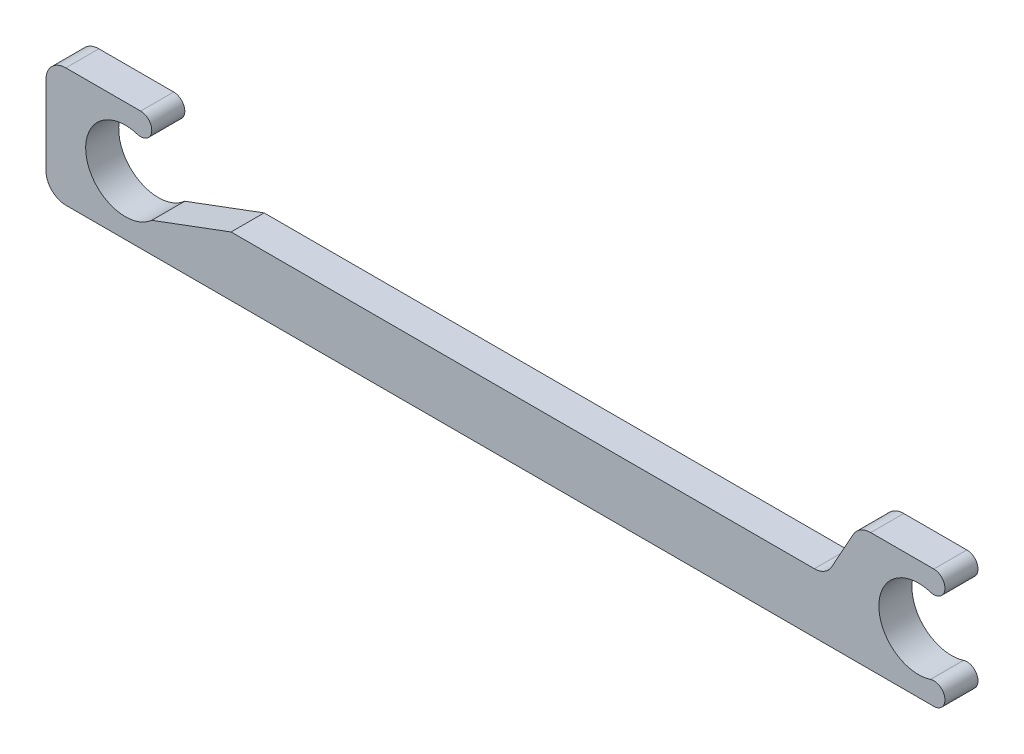
ISO-10303-21;
HEADER;
FILE_DESCRIPTION(('STEP AP214'),'2;1');
FILE_NAME('part.step','',(''),(''),'','','');
FILE_SCHEMA(('AUTOMOTIVE_DESIGN { 1 0 10303 214 1 1 1 1 }'));
ENDSEC;
DATA;
#1=APPLICATION_CONTEXT('core data for automotive mechanical design processes');
#2=APPLICATION_PROTOCOL_DEFINITION('international standard','automotive_design',2000,#1);
#3=PRODUCT_CONTEXT('',#1,'mechanical');
#4=PRODUCT('Part','Part','',(#3));
#5=PRODUCT_RELATED_PRODUCT_CATEGORY('part','',(#4));
#6=PRODUCT_DEFINITION_FORMATION('','',#4);
#7=PRODUCT_DEFINITION_CONTEXT('part definition',#1,'design');
#8=PRODUCT_DEFINITION('design','',#6,#7);
#9=PRODUCT_DEFINITION_SHAPE('','',#8);
#10=(LENGTH_UNIT() NAMED_UNIT(*) SI_UNIT(.MILLI.,.METRE.));
#11=(NAMED_UNIT(*) PLANE_ANGLE_UNIT() SI_UNIT($,.RADIAN.));
#12=(NAMED_UNIT(*) SI_UNIT($,.STERADIAN.) SOLID_ANGLE_UNIT());
#13=UNCERTAINTY_MEASURE_WITH_UNIT(LENGTH_MEASURE(1.E-05),#10,'distance_accuracy_value','');
#14=(GEOMETRIC_REPRESENTATION_CONTEXT(3) GLOBAL_UNCERTAINTY_ASSIGNED_CONTEXT((#13)) GLOBAL_UNIT_ASSIGNED_CONTEXT((#10,
#11,#12)) REPRESENTATION_CONTEXT('',''));
#15=CARTESIAN_POINT('',(0.,0.,0.));
#16=DIRECTION('',(0.,0.,1.));
#17=DIRECTION('',(1.,0.,0.));
#18=AXIS2_PLACEMENT_3D('',#15,#16,#17);
#19=CARTESIAN_POINT('',(61.8130168755118,-5.71952531326766,3.));
#20=CARTESIAN_POINT('',(61.8130168755118,-5.71952531326766,2.83333333333334));
#21=CARTESIAN_POINT('',(61.8130168755118,-5.71952531326766,2.66666666666665));
#22=CARTESIAN_POINT('',(61.8130168755118,-5.71952531326766,0.833333333333472));
#23=CARTESIAN_POINT('',(61.8130168755118,-5.71952531326766,-0.833333333332929));
#24=CARTESIAN_POINT('',(61.8130168755118,-5.71952531326766,-2.66666666666671));
#25=CARTESIAN_POINT('',(61.8130168755118,-5.71952531326766,-2.8333333333333));
#26=CARTESIAN_POINT('',(61.8130168755118,-5.71952531326766,-3.));
#27=CARTESIAN_POINT('',(62.9874962335552,-5.34723027487812,3.));
#28=CARTESIAN_POINT('',(62.9874962335552,-5.34723027487812,2.83333333333334));
#29=CARTESIAN_POINT('',(62.9874962335552,-5.34723027487812,2.66666666666665));
#30=CARTESIAN_POINT('',(62.9874962335552,-5.34723027487812,0.833333333333472));
#31=CARTESIAN_POINT('',(62.9874962335552,-5.34723027487812,-0.833333333332929));
#32=CARTESIAN_POINT('',(62.9874962335552,-5.34723027487812,-2.66666666666671));
#33=CARTESIAN_POINT('',(62.9874962335552,-5.34723027487812,-2.8333333333333));
#34=CARTESIAN_POINT('',(62.9874962335552,-5.34723027487812,-3.));
#35=CARTESIAN_POINT('',(65.0570686246106,-5.80753963794994,3.));
#36=CARTESIAN_POINT('',(65.0570686246106,-5.80753963794994,2.83333333333334));
#37=CARTESIAN_POINT('',(65.0570686246106,-5.80753963794994,2.66666666666665));
#38=CARTESIAN_POINT('',(65.0570686246106,-5.80753963794994,0.833333333333472));
#39=CARTESIAN_POINT('',(65.0570686246106,-5.80753963794994,-0.833333333332929));
#40=CARTESIAN_POINT('',(65.0570686246106,-5.80753963794994,-2.66666666666671));
#41=CARTESIAN_POINT('',(65.0570686246106,-5.80753963794994,-2.8333333333333));
#42=CARTESIAN_POINT('',(65.0570686246106,-5.80753963794994,-3.));
#43=CARTESIAN_POINT('',(65.3863188491197,-7.93584654598331,3.));
#44=CARTESIAN_POINT('',(65.3863188491197,-7.93584654598331,2.83333333333334));
#45=CARTESIAN_POINT('',(65.3863188491197,-7.93584654598331,2.66666666666665));
#46=CARTESIAN_POINT('',(65.3863188491197,-7.93584654598331,0.833333333333472));
#47=CARTESIAN_POINT('',(65.3863188491197,-7.93584654598331,-0.833333333332929));
#48=CARTESIAN_POINT('',(65.3863188491197,-7.93584654598331,-2.66666666666671));
#49=CARTESIAN_POINT('',(65.3863188491197,-7.93584654598331,-2.8333333333333));
#50=CARTESIAN_POINT('',(65.3863188491197,-7.93584654598331,-3.));
#51=CARTESIAN_POINT('',(63.552581676607,-9.,3.));
#52=CARTESIAN_POINT('',(63.552581676607,-9.,2.83333333333334));
#53=CARTESIAN_POINT('',(63.552581676607,-9.,2.66666666666665));
#54=CARTESIAN_POINT('',(63.552581676607,-9.,0.833333333333472));
#55=CARTESIAN_POINT('',(63.552581676607,-9.,-0.833333333332929));
#56=CARTESIAN_POINT('',(63.552581676607,-9.,-2.66666666666671));
#57=CARTESIAN_POINT('',(63.552581676607,-9.,-2.8333333333333));
#58=CARTESIAN_POINT('',(63.552581676607,-9.,-3.));
#59=CARTESIAN_POINT('',(62.3205080756888,-9.,3.));
#60=CARTESIAN_POINT('',(62.3205080756888,-9.,2.83333333333334));
#61=CARTESIAN_POINT('',(62.3205080756888,-9.,2.66666666666665));
#62=CARTESIAN_POINT('',(62.3205080756888,-9.,0.833333333333472));
#63=CARTESIAN_POINT('',(62.3205080756888,-9.,-0.833333333332929));
#64=CARTESIAN_POINT('',(62.3205080756888,-9.,-2.66666666666671));
#65=CARTESIAN_POINT('',(62.3205080756888,-9.,-2.8333333333333));
#66=CARTESIAN_POINT('',(62.3205080756888,-9.,-3.));
#67=(BOUNDED_SURFACE() B_SPLINE_SURFACE(5,3,((#19,#20,#21,#22,#23,#24,#25,#26),(#27,#28,#29,#30,
#31,#32,#33,#34),(#35,#36,#37,#38,#39,#40,#41,#42),(#43,#44,#45,#46,#47,#48,#49,#50),(#51,#52,
#53,#54,#55,#56,#57,#58),(#59,#60,#61,#62,#63,#64,#65,#66)),.UNSPECIFIED.,.F.,.F.,
.F.) B_SPLINE_SURFACE_WITH_KNOTS((6,6),(4,2,2,4),(0.,1.),(-0.1,0.,1.,1.1),
.UNSPECIFIED.) GEOMETRIC_REPRESENTATION_ITEM() RATIONAL_B_SPLINE_SURFACE(((1.,1.,1.,1.,1.,1.,1.,
1.),(0.53884722009782,0.53884722009782,0.53884722009782,0.53884722009782,0.53884722009782,
0.53884722009782,0.53884722009782,0.53884722009782),(0.308270830146729,0.308270830146729,
0.308270830146729,0.308270830146729,0.308270830146729,0.308270830146729,0.308270830146729,
0.308270830146729),(0.308270830146729,0.308270830146729,0.308270830146729,0.308270830146729,
0.308270830146729,0.308270830146729,0.308270830146729,0.308270830146729),(0.53884722009782,
0.53884722009782,0.53884722009782,0.53884722009782,0.53884722009782,0.53884722009782,
0.53884722009782,0.53884722009782),(1.,1.,1.,1.,1.,1.,1.,1.))) REPRESENTATION_ITEM('') SURFACE());
#68=CARTESIAN_POINT('',(61.8130168755118,-5.71952531326766,-3.));
#69=CARTESIAN_POINT('',(61.8130168755118,-5.71952531326766,-2.8333333333333));
#70=CARTESIAN_POINT('',(61.8130168755118,-5.71952531326766,-2.66666666666671));
#71=CARTESIAN_POINT('',(61.8130168755118,-5.71952531326766,-0.833333333332929));
#72=CARTESIAN_POINT('',(61.8130168755118,-5.71952531326766,0.833333333333472));
#73=CARTESIAN_POINT('',(61.8130168755118,-5.71952531326766,2.66666666666665));
#74=CARTESIAN_POINT('',(61.8130168755118,-5.71952531326766,2.83333333333334));
#75=CARTESIAN_POINT('',(61.8130168755118,-5.71952531326766,3.));
#76=(BOUNDED_CURVE() B_SPLINE_CURVE(3,(#68,#69,#70,#71,#72,#73,#74,#75),.UNSPECIFIED.,.F.,
.F.) B_SPLINE_CURVE_WITH_KNOTS((4,2,2,4),(-0.1,0.,1.,1.1),
.UNSPECIFIED.) CURVE() GEOMETRIC_REPRESENTATION_ITEM() RATIONAL_B_SPLINE_CURVE((1.,1.,1.,1.,1.,
1.,1.,1.)) REPRESENTATION_ITEM(''));
#77=CARTESIAN_POINT('',(61.8130168755118,-5.71952531326767,2.5));
#78=VERTEX_POINT('',#77);
#79=CARTESIAN_POINT('',(61.8130168755118,-5.71952531326766,-2.5));
#80=VERTEX_POINT('',#79);
#81=EDGE_CURVE('E305',#78,#80,#76,.F.);
#82=CARTESIAN_POINT('',(61.8130168755118,-5.71952531326766,2.5));
#83=CARTESIAN_POINT('',(62.9874962335552,-5.34723027487812,2.5));
#84=CARTESIAN_POINT('',(65.0570686246106,-5.80753963794994,2.5));
#85=CARTESIAN_POINT('',(65.3863188491197,-7.93584654598331,2.5));
#86=CARTESIAN_POINT('',(63.552581676607,-9.,2.5));
#87=CARTESIAN_POINT('',(62.3205080756888,-9.,2.5));
#88=(BOUNDED_CURVE() B_SPLINE_CURVE(5,(#82,#83,#84,#85,#86,#87),.UNSPECIFIED.,.F.,
.F.) B_SPLINE_CURVE_WITH_KNOTS((6,6),(0.,1.),
.UNSPECIFIED.) CURVE() GEOMETRIC_REPRESENTATION_ITEM() RATIONAL_B_SPLINE_CURVE((1.,
0.53884722009782,0.308270830146729,0.308270830146729,0.53884722009782,1.)) REPRESENTATION_ITEM(''));
#89=CARTESIAN_POINT('',(62.3205080756888,-9.,2.5));
#90=VERTEX_POINT('',#89);
#91=EDGE_CURVE('E578',#90,#78,#88,.F.);
#92=CARTESIAN_POINT('',(62.3205080756888,-9.,3.));
#93=CARTESIAN_POINT('',(62.3205080756888,-9.,2.83333333333334));
#94=CARTESIAN_POINT('',(62.3205080756888,-9.,2.66666666666665));
#95=CARTESIAN_POINT('',(62.3205080756888,-9.,0.833333333333472));
#96=CARTESIAN_POINT('',(62.3205080756888,-9.,-0.833333333332929));
#97=CARTESIAN_POINT('',(62.3205080756888,-9.,-2.66666666666671));
#98=CARTESIAN_POINT('',(62.3205080756888,-9.,-2.8333333333333));
#99=CARTESIAN_POINT('',(62.3205080756888,-9.,-3.));
#100=(BOUNDED_CURVE() B_SPLINE_CURVE(3,(#92,#93,#94,#95,#96,#97,#98,#99),.UNSPECIFIED.,.F.,
.F.) B_SPLINE_CURVE_WITH_KNOTS((4,2,2,4),(-0.1,0.,1.,1.1),
.UNSPECIFIED.) CURVE() GEOMETRIC_REPRESENTATION_ITEM() RATIONAL_B_SPLINE_CURVE((1.,1.,1.,1.,1.,
1.,1.,1.)) REPRESENTATION_ITEM(''));
#101=CARTESIAN_POINT('',(62.3205080756888,-9.,-2.5));
#102=VERTEX_POINT('',#101);
#103=EDGE_CURVE('E580',#102,#90,#100,.F.);
#104=CARTESIAN_POINT('',(62.3205080756888,-9.,-2.5));
#105=CARTESIAN_POINT('',(63.552581676607,-9.,-2.5));
#106=CARTESIAN_POINT('',(65.3863188491197,-7.93584654598331,-2.5));
#107=CARTESIAN_POINT('',(65.0570686246106,-5.80753963794994,-2.5));
#108=CARTESIAN_POINT('',(62.9874962335552,-5.34723027487812,-2.5));
#109=CARTESIAN_POINT('',(61.8130168755118,-5.71952531326766,-2.5));
#110=(BOUNDED_CURVE() B_SPLINE_CURVE(5,(#104,#105,#106,#107,#108,#109),.UNSPECIFIED.,.F.,
.F.) B_SPLINE_CURVE_WITH_KNOTS((6,6),(0.,1.),
.UNSPECIFIED.) CURVE() GEOMETRIC_REPRESENTATION_ITEM() RATIONAL_B_SPLINE_CURVE((1.,
0.53884722009782,0.308270830146729,0.308270830146729,0.53884722009782,1.)) REPRESENTATION_ITEM(''));
#111=EDGE_CURVE('E353',#80,#102,#110,.F.);
#112=ORIENTED_EDGE('',*,*,#81,.F.);
#113=ORIENTED_EDGE('',*,*,#91,.F.);
#114=ORIENTED_EDGE('',*,*,#103,.F.);
#115=ORIENTED_EDGE('',*,*,#111,.F.);
#116=EDGE_LOOP('',(#112,#113,#114,#115));
#117=FACE_BOUND('',#116,.T.);
#118=ADVANCED_FACE('F43',(#117),#67,.T.);
#119=CARTESIAN_POINT('',(62.3205080756769,9.00000000000001,3.));
#120=CARTESIAN_POINT('',(62.3205080756769,9.00000000000001,2.83333333333334));
#121=CARTESIAN_POINT('',(62.3205080756358,9.00000000000001,2.66666666666665));
#122=CARTESIAN_POINT('',(62.3205080756358,9.00000000000001,0.833333333333472));
#123=CARTESIAN_POINT('',(62.3205080756358,9.00000000000001,-0.833333333332929));
#124=CARTESIAN_POINT('',(62.3205080756358,9.00000000000001,-2.66666666666671));
#125=CARTESIAN_POINT('',(62.3205080756769,9.00000000000001,-2.8333333333333));
#126=CARTESIAN_POINT('',(62.3205080756769,9.00000000000001,-3.));
#127=CARTESIAN_POINT('',(63.5525816765993,9.00000000000611,3.));
#128=CARTESIAN_POINT('',(63.5525816765993,9.00000000000611,2.83333333333334));
#129=CARTESIAN_POINT('',(63.5525816765727,9.00000000002735,2.66666666666665));
#130=CARTESIAN_POINT('',(63.5525816765727,9.00000000002735,0.833333333333472));
#131=CARTESIAN_POINT('',(63.5525816765727,9.00000000002735,-0.833333333332929));
#132=CARTESIAN_POINT('',(63.5525816765727,9.00000000002735,-2.66666666666671));
#133=CARTESIAN_POINT('',(63.5525816765993,9.00000000000611,-2.8333333333333));
#134=CARTESIAN_POINT('',(63.5525816765993,9.00000000000611,-3.));
#135=CARTESIAN_POINT('',(65.3863188491365,7.93584654598996,3.));
#136=CARTESIAN_POINT('',(65.3863188491365,7.93584654598996,2.83333333333337));
#137=CARTESIAN_POINT('',(65.3863188491951,7.93584654601308,2.66666666666662));
#138=CARTESIAN_POINT('',(65.3863188491951,7.93584654601308,0.833333333333834));
#139=CARTESIAN_POINT('',(65.3863188491951,7.93584654601308,-0.83333333333329));
#140=CARTESIAN_POINT('',(65.3863188491951,7.93584654601308,-2.66666666666667));
#141=CARTESIAN_POINT('',(65.3863188491365,7.93584654598996,-2.83333333333333));
#142=CARTESIAN_POINT('',(65.3863188491365,7.93584654598996,-3.));
#143=CARTESIAN_POINT('',(65.0570686246242,5.80753963793814,3.));
#144=CARTESIAN_POINT('',(65.0570686246242,5.80753963793814,2.83333333333337));
#145=CARTESIAN_POINT('',(65.0570686246712,5.80753963789706,2.66666666666662));
#146=CARTESIAN_POINT('',(65.0570686246712,5.80753963789706,0.833333333333834));
#147=CARTESIAN_POINT('',(65.0570686246712,5.80753963789706,-0.83333333333329));
#148=CARTESIAN_POINT('',(65.0570686246712,5.80753963789706,-2.66666666666667));
#149=CARTESIAN_POINT('',(65.0570686246242,5.80753963793814,-2.83333333333333));
#150=CARTESIAN_POINT('',(65.0570686246242,5.80753963793814,-3.));
#151=CARTESIAN_POINT('',(62.9874962335452,5.34723027487464,3.));
#152=CARTESIAN_POINT('',(62.9874962335452,5.34723027487464,2.83333333333334));
#153=CARTESIAN_POINT('',(62.9874962335105,5.34723027486255,2.66666666666665));
#154=CARTESIAN_POINT('',(62.9874962335105,5.34723027486255,0.833333333333472));
#155=CARTESIAN_POINT('',(62.9874962335105,5.34723027486255,-0.833333333332929));
#156=CARTESIAN_POINT('',(62.9874962335105,5.34723027486255,-2.66666666666671));
#157=CARTESIAN_POINT('',(62.9874962335452,5.34723027487464,-2.8333333333333));
#158=CARTESIAN_POINT('',(62.9874962335452,5.34723027487464,-3.));
#159=CARTESIAN_POINT('',(61.8130168754997,5.71952531327148,3.));
#160=CARTESIAN_POINT('',(61.8130168754997,5.71952531327148,2.83333333333334));
#161=CARTESIAN_POINT('',(61.8130168754578,5.71952531328476,2.66666666666665));
#162=CARTESIAN_POINT('',(61.8130168754578,5.71952531328476,0.833333333333472));
#163=CARTESIAN_POINT('',(61.8130168754578,5.71952531328476,-0.833333333332929));
#164=CARTESIAN_POINT('',(61.8130168754578,5.71952531328476,-2.66666666666671));
#165=CARTESIAN_POINT('',(61.8130168754997,5.71952531327148,-2.8333333333333));
#166=CARTESIAN_POINT('',(61.8130168754997,5.71952531327148,-3.));
#167=(BOUNDED_SURFACE() B_SPLINE_SURFACE(5,3,((#119,#120,#121,#122,#123,#124,#125,#126),(#127,
#128,#129,#130,#131,#132,#133,#134),(#135,#136,#137,#138,#139,#140,#141,#142),(#143,#144,#145,
#146,#147,#148,#149,#150),(#151,#152,#153,#154,#155,#156,#157,#158),(#159,#160,#161,#162,#163,
#164,#165,#166)),.UNSPECIFIED.,.F.,.F.,.F.) B_SPLINE_SURFACE_WITH_KNOTS((6,6),(4,2,2,4),(0.,1.),
(-0.1,0.,1.,1.1),.UNSPECIFIED.) GEOMETRIC_REPRESENTATION_ITEM() RATIONAL_B_SPLINE_SURFACE(((1.,
1.,1.,1.,1.,1.,1.,1.),(0.538847220095827,0.538847220095827,0.538847220088886,0.538847220088886,
0.538847220088886,0.538847220088886,0.538847220095827,0.538847220095827),(0.30827083014374,
0.30827083014374,0.30827083013333,0.30827083013333,0.30827083013333,0.30827083013333,
0.30827083014374,0.30827083014374),(0.30827083014374,0.30827083014374,0.30827083013333,
0.30827083013333,0.30827083013333,0.30827083013333,0.30827083014374,0.30827083014374),
(0.538847220095827,0.538847220095827,0.538847220088886,0.538847220088886,0.538847220088886,
0.538847220088886,0.538847220095827,0.538847220095827),(1.,1.,1.,1.,1.,1.,1.,1.))) REPRESENTATION_ITEM('') SURFACE());
#168=CARTESIAN_POINT('',(61.8130168754997,5.71952531327148,3.));
#169=CARTESIAN_POINT('',(61.8130168754997,5.71952531327148,2.83333333333334));
#170=CARTESIAN_POINT('',(61.8130168754578,5.71952531328476,2.66666666666665));
#171=CARTESIAN_POINT('',(61.8130168754578,5.71952531328476,0.833333333333472));
#172=CARTESIAN_POINT('',(61.8130168754578,5.71952531328476,-0.833333333332929));
#173=CARTESIAN_POINT('',(61.8130168754578,5.71952531328476,-2.66666666666671));
#174=CARTESIAN_POINT('',(61.8130168754997,5.71952531327148,-2.8333333333333));
#175=CARTESIAN_POINT('',(61.8130168754997,5.71952531327148,-3.));
#176=(BOUNDED_CURVE() B_SPLINE_CURVE(3,(#168,#169,#170,#171,#172,#173,#174,#175),.UNSPECIFIED.,
.F.,.F.) B_SPLINE_CURVE_WITH_KNOTS((4,2,2,4),(-0.1,0.,1.,1.1),
.UNSPECIFIED.) CURVE() GEOMETRIC_REPRESENTATION_ITEM() RATIONAL_B_SPLINE_CURVE((1.,1.,1.,1.,1.,
1.,1.,1.)) REPRESENTATION_ITEM(''));
#177=CARTESIAN_POINT('',(61.8130168754578,5.71952531328476,-2.5));
#178=VERTEX_POINT('',#177);
#179=CARTESIAN_POINT('',(61.8130168754578,5.71952531328477,2.5));
#180=VERTEX_POINT('',#179);
#181=EDGE_CURVE('E565',#178,#180,#176,.F.);
#182=CARTESIAN_POINT('',(61.8130168754578,5.71952531328476,-2.5));
#183=CARTESIAN_POINT('',(62.9874962335105,5.34723027486255,-2.5));
#184=CARTESIAN_POINT('',(65.0570686246712,5.80753963789706,-2.5));
#185=CARTESIAN_POINT('',(65.3863188491951,7.93584654601308,-2.5));
#186=CARTESIAN_POINT('',(63.5525816765727,9.00000000002735,-2.5));
#187=CARTESIAN_POINT('',(62.3205080756358,9.00000000000001,-2.5));
#188=(BOUNDED_CURVE() B_SPLINE_CURVE(5,(#182,#183,#184,#185,#186,#187),.UNSPECIFIED.,.F.,
.F.) B_SPLINE_CURVE_WITH_KNOTS((6,6),(0.,1.),
.UNSPECIFIED.) CURVE() GEOMETRIC_REPRESENTATION_ITEM() RATIONAL_B_SPLINE_CURVE((1.,
0.538847220088886,0.30827083013333,0.30827083013333,0.538847220088886,1.)) REPRESENTATION_ITEM(''));
#189=CARTESIAN_POINT('',(62.3205080756358,9.00000000000001,-2.5));
#190=VERTEX_POINT('',#189);
#191=EDGE_CURVE('E260',#190,#178,#188,.F.);
#192=CARTESIAN_POINT('',(62.3205080756769,9.00000000000001,-3.));
#193=CARTESIAN_POINT('',(62.3205080756769,9.00000000000001,-2.8333333333333));
#194=CARTESIAN_POINT('',(62.3205080756358,9.00000000000001,-2.66666666666671));
#195=CARTESIAN_POINT('',(62.3205080756358,9.00000000000001,-0.833333333332929));
#196=CARTESIAN_POINT('',(62.3205080756358,9.00000000000001,0.833333333333472));
#197=CARTESIAN_POINT('',(62.3205080756358,9.00000000000001,2.66666666666665));
#198=CARTESIAN_POINT('',(62.3205080756769,9.00000000000001,2.83333333333334));
#199=CARTESIAN_POINT('',(62.3205080756769,9.00000000000001,3.));
#200=(BOUNDED_CURVE() B_SPLINE_CURVE(3,(#192,#193,#194,#195,#196,#197,#198,#199),.UNSPECIFIED.,
.F.,.F.) B_SPLINE_CURVE_WITH_KNOTS((4,2,2,4),(-0.1,0.,1.,1.1),
.UNSPECIFIED.) CURVE() GEOMETRIC_REPRESENTATION_ITEM() RATIONAL_B_SPLINE_CURVE((1.,1.,1.,1.,1.,
1.,1.,1.)) REPRESENTATION_ITEM(''));
#201=CARTESIAN_POINT('',(62.3205080756357,9.00000000000001,2.5));
#202=VERTEX_POINT('',#201);
#203=EDGE_CURVE('E574',#202,#190,#200,.F.);
#204=CARTESIAN_POINT('',(62.3205080756358,9.00000000000001,2.5));
#205=CARTESIAN_POINT('',(63.5525816765727,9.00000000002735,2.5));
#206=CARTESIAN_POINT('',(65.3863188491951,7.93584654601308,2.5));
#207=CARTESIAN_POINT('',(65.0570686246712,5.80753963789706,2.5));
#208=CARTESIAN_POINT('',(62.9874962335105,5.34723027486255,2.5));
#209=CARTESIAN_POINT('',(61.8130168754578,5.71952531328476,2.5));
#210=(BOUNDED_CURVE() B_SPLINE_CURVE(5,(#204,#205,#206,#207,#208,#209),.UNSPECIFIED.,.F.,
.F.) B_SPLINE_CURVE_WITH_KNOTS((6,6),(0.,1.),
.UNSPECIFIED.) CURVE() GEOMETRIC_REPRESENTATION_ITEM() RATIONAL_B_SPLINE_CURVE((1.,
0.538847220088886,0.30827083013333,0.30827083013333,0.538847220088886,1.)) REPRESENTATION_ITEM(''));
#211=EDGE_CURVE('E570',#180,#202,#210,.F.);
#212=ORIENTED_EDGE('',*,*,#181,.F.);
#213=ORIENTED_EDGE('',*,*,#191,.F.);
#214=ORIENTED_EDGE('',*,*,#203,.F.);
#215=ORIENTED_EDGE('',*,*,#211,.F.);
#216=EDGE_LOOP('',(#212,#213,#214,#215));
#217=FACE_BOUND('',#216,.T.);
#218=ADVANCED_FACE('F327',(#217),#167,.T.);
#219=CARTESIAN_POINT('',(-57.679491924323,9.,3.));
#220=CARTESIAN_POINT('',(-57.679491924323,9.,2.83333333333291));
#221=CARTESIAN_POINT('',(-57.6794919243631,9.,2.66666666666723));
#222=CARTESIAN_POINT('',(-57.6794919243758,9.,0.83333333332769));
#223=CARTESIAN_POINT('',(-57.6794919243642,9.,-0.833333333332929));
#224=CARTESIAN_POINT('',(-57.6794919243642,9.,-2.66666666666671));
#225=CARTESIAN_POINT('',(-57.679491924323,9.,-2.8333333333333));
#226=CARTESIAN_POINT('',(-57.679491924323,9.,-3.));
#227=CARTESIAN_POINT('',(-56.4474183234007,9.00000000000609,3.));
#228=CARTESIAN_POINT('',(-56.4474183234007,9.00000000000609,2.83333333333323));
#229=CARTESIAN_POINT('',(-56.4474183234262,9.00000000002647,2.66666666666663));
#230=CARTESIAN_POINT('',(-56.4474183234389,9.00000000003601,0.833333333315429));
#231=CARTESIAN_POINT('',(-56.4474183234273,9.00000000002734,-0.833333333332929));
#232=CARTESIAN_POINT('',(-56.4474183234273,9.00000000002734,-2.66666666666671));
#233=CARTESIAN_POINT('',(-56.4474183234007,9.00000000000609,-2.8333333333333));
#234=CARTESIAN_POINT('',(-56.4474183234007,9.00000000000609,-3.));
#235=CARTESIAN_POINT('',(-54.6136811508635,7.93584654598995,3.));
#236=CARTESIAN_POINT('',(-54.6136811508635,7.93584654598995,2.83333333333367));
#237=CARTESIAN_POINT('',(-54.6136811508083,7.93584654601234,2.66666666666579));
#238=CARTESIAN_POINT('',(-54.6136811507702,7.93584654602029,0.833333333294791));
#239=CARTESIAN_POINT('',(-54.6136811508049,7.93584654601306,-0.833333333332928));
#240=CARTESIAN_POINT('',(-54.6136811508049,7.93584654601306,-2.66666666666671));
#241=CARTESIAN_POINT('',(-54.6136811508635,7.93584654598995,-2.8333333333333));
#242=CARTESIAN_POINT('',(-54.6136811508635,7.93584654598995,-3.));
#243=CARTESIAN_POINT('',(-54.9429313753759,5.80753963793814,3.));
#244=CARTESIAN_POINT('',(-54.9429313753759,5.80753963793814,2.83333333333359));
#245=CARTESIAN_POINT('',(-54.9429313753317,5.80753963789857,2.6666666666659));
#246=CARTESIAN_POINT('',(-54.9429313752999,5.80753963788187,0.833333333293707));
#247=CARTESIAN_POINT('',(-54.9429313753288,5.80753963789705,-0.833333333332928));
#248=CARTESIAN_POINT('',(-54.9429313753288,5.80753963789705,-2.66666666666671));
#249=CARTESIAN_POINT('',(-54.9429313753759,5.80753963793814,-2.8333333333333));
#250=CARTESIAN_POINT('',(-54.9429313753759,5.80753963793814,-3.));
#251=CARTESIAN_POINT('',(-57.0125037664548,5.34723027487464,3.));
#252=CARTESIAN_POINT('',(-57.0125037664548,5.34723027487464,2.83333333333307));
#253=CARTESIAN_POINT('',(-57.0125037664883,5.34723027486312,2.66666666666685));
#254=CARTESIAN_POINT('',(-57.0125037665011,5.34723027485676,0.833333333313261));
#255=CARTESIAN_POINT('',(-57.0125037664895,5.34723027486254,-0.833333333332929));
#256=CARTESIAN_POINT('',(-57.0125037664895,5.34723027486254,-2.66666666666671));
#257=CARTESIAN_POINT('',(-57.0125037664548,5.34723027487464,-2.8333333333333));
#258=CARTESIAN_POINT('',(-57.0125037664548,5.34723027487464,-3.));
#259=CARTESIAN_POINT('',(-58.1869831245003,5.71952531327148,3.));
#260=CARTESIAN_POINT('',(-58.1869831245003,5.71952531327148,2.83333333333277));
#261=CARTESIAN_POINT('',(-58.186983124541,5.71952531328439,2.66666666666741));
#262=CARTESIAN_POINT('',(-58.1869831245537,5.71952531328842,0.833333333325883));
#263=CARTESIAN_POINT('',(-58.1869831245422,5.71952531328476,-0.833333333332929));
#264=CARTESIAN_POINT('',(-58.1869831245422,5.71952531328476,-2.66666666666671));
#265=CARTESIAN_POINT('',(-58.1869831245003,5.71952531327148,-2.8333333333333));
#266=CARTESIAN_POINT('',(-58.1869831245003,5.71952531327148,-3.));
#267=(BOUNDED_SURFACE() B_SPLINE_SURFACE(5,3,((#219,#220,#221,#222,#223,#224,#225,#226),(#227,
#228,#229,#230,#231,#232,#233,#234),(#235,#236,#237,#238,#239,#240,#241,#242),(#243,#244,#245,
#246,#247,#248,#249,#250),(#251,#252,#253,#254,#255,#256,#257,#258),(#259,#260,#261,#262,#263,
#264,#265,#266)),.UNSPECIFIED.,.F.,.F.,.F.) B_SPLINE_SURFACE_WITH_KNOTS((6,6),(4,2,2,4),(0.,1.),
(-0.1,0.,1.,1.1),.UNSPECIFIED.) GEOMETRIC_REPRESENTATION_ITEM() RATIONAL_B_SPLINE_SURFACE(((1.,
1.,1.,1.,1.,1.,1.,1.),(0.538847220095827,0.538847220095827,0.538847220089423,0.53884722008352,
0.538847220088886,0.538847220088886,0.538847220095827,0.538847220095827),(0.30827083014374,
0.30827083014374,0.308270830134125,0.308270830125373,0.308270830133329,0.308270830133329,
0.30827083014374,0.30827083014374),(0.30827083014374,0.30827083014374,0.308270830134125,
0.308270830125373,0.308270830133329,0.308270830133329,0.30827083014374,0.30827083014374),
(0.538847220095827,0.538847220095827,0.538847220089423,0.53884722008352,0.538847220088886,
0.538847220088886,0.538847220095827,0.538847220095827),(1.,1.,1.,1.,1.,1.,1.,1.))) REPRESENTATION_ITEM('') SURFACE());
#268=CARTESIAN_POINT('',(-58.1869831245003,5.71952531327148,3.));
#269=CARTESIAN_POINT('',(-58.1869831245003,5.71952531327148,2.83333333333277));
#270=CARTESIAN_POINT('',(-58.186983124541,5.71952531328439,2.66666666666741));
#271=CARTESIAN_POINT('',(-58.1869831245537,5.71952531328842,0.833333333325883));
#272=CARTESIAN_POINT('',(-58.1869831245422,5.71952531328476,-0.833333333332929));
#273=CARTESIAN_POINT('',(-58.1869831245422,5.71952531328476,-2.66666666666671));
#274=CARTESIAN_POINT('',(-58.1869831245003,5.71952531327148,-2.8333333333333));
#275=CARTESIAN_POINT('',(-58.1869831245003,5.71952531327148,-3.));
#276=(BOUNDED_CURVE() B_SPLINE_CURVE(3,(#268,#269,#270,#271,#272,#273,#274,#275),.UNSPECIFIED.,
.F.,.F.) B_SPLINE_CURVE_WITH_KNOTS((4,2,2,4),(-0.1,0.,1.,1.1),
.UNSPECIFIED.) CURVE() GEOMETRIC_REPRESENTATION_ITEM() RATIONAL_B_SPLINE_CURVE((1.,1.,1.,1.,1.,
1.,1.,1.)) REPRESENTATION_ITEM(''));
#277=CARTESIAN_POINT('',(-58.1869831245422,5.71952531328476,-2.5));
#278=VERTEX_POINT('',#277);
#279=CARTESIAN_POINT('',(-58.1869831245422,5.71952531328477,2.5));
#280=VERTEX_POINT('',#279);
#281=EDGE_CURVE('E182',#278,#280,#276,.F.);
#282=CARTESIAN_POINT('',(-58.1869831245422,5.71952531328476,-2.5));
#283=CARTESIAN_POINT('',(-57.0125037664895,5.34723027486254,-2.5));
#284=CARTESIAN_POINT('',(-54.9429313753288,5.80753963789705,-2.5));
#285=CARTESIAN_POINT('',(-54.6136811508049,7.93584654601306,-2.5));
#286=CARTESIAN_POINT('',(-56.4474183234273,9.00000000002734,-2.5));
#287=CARTESIAN_POINT('',(-57.6794919243642,9.,-2.5));
#288=(BOUNDED_CURVE() B_SPLINE_CURVE(5,(#282,#283,#284,#285,#286,#287),.UNSPECIFIED.,.F.,
.F.) B_SPLINE_CURVE_WITH_KNOTS((6,6),(0.,1.),
.UNSPECIFIED.) CURVE() GEOMETRIC_REPRESENTATION_ITEM() RATIONAL_B_SPLINE_CURVE((1.,
0.538847220088886,0.308270830133329,0.308270830133329,0.538847220088886,1.)) REPRESENTATION_ITEM(''));
#289=CARTESIAN_POINT('',(-57.6794919243642,9.,-2.5));
#290=VERTEX_POINT('',#289);
#291=EDGE_CURVE('E508',#290,#278,#288,.F.);
#292=CARTESIAN_POINT('',(-57.679491924323,9.,-3.));
#293=CARTESIAN_POINT('',(-57.679491924323,9.,-2.8333333333333));
#294=CARTESIAN_POINT('',(-57.6794919243642,9.,-2.66666666666671));
#295=CARTESIAN_POINT('',(-57.6794919243642,9.,-0.833333333332929));
#296=CARTESIAN_POINT('',(-57.6794919243758,9.,0.83333333332769));
#297=CARTESIAN_POINT('',(-57.6794919243631,9.,2.66666666666723));
#298=CARTESIAN_POINT('',(-57.679491924323,9.,2.83333333333291));
#299=CARTESIAN_POINT('',(-57.679491924323,9.,3.));
#300=(BOUNDED_CURVE() B_SPLINE_CURVE(3,(#292,#293,#294,#295,#296,#297,#298,#299),.UNSPECIFIED.,
.F.,.F.) B_SPLINE_CURVE_WITH_KNOTS((4,2,2,4),(-0.1,0.,1.,1.1),
.UNSPECIFIED.) CURVE() GEOMETRIC_REPRESENTATION_ITEM() RATIONAL_B_SPLINE_CURVE((1.,1.,1.,1.,1.,
1.,1.,1.)) REPRESENTATION_ITEM(''));
#301=CARTESIAN_POINT('',(-57.6794919243642,9.,2.5));
#302=VERTEX_POINT('',#301);
#303=EDGE_CURVE('E500',#302,#290,#300,.F.);
#304=CARTESIAN_POINT('',(-57.6794919243642,9.,2.5));
#305=CARTESIAN_POINT('',(-56.4474183234273,9.00000000002734,2.5));
#306=CARTESIAN_POINT('',(-54.6136811508049,7.93584654601306,2.5));
#307=CARTESIAN_POINT('',(-54.9429313753288,5.80753963789705,2.5));
#308=CARTESIAN_POINT('',(-57.0125037664895,5.34723027486254,2.5));
#309=CARTESIAN_POINT('',(-58.1869831245422,5.71952531328476,2.5));
#310=(BOUNDED_CURVE() B_SPLINE_CURVE(5,(#304,#305,#306,#307,#308,#309),.UNSPECIFIED.,.F.,
.F.) B_SPLINE_CURVE_WITH_KNOTS((6,6),(0.,1.),
.UNSPECIFIED.) CURVE() GEOMETRIC_REPRESENTATION_ITEM() RATIONAL_B_SPLINE_CURVE((1.,
0.538847220088886,0.308270830133329,0.308270830133329,0.538847220088886,1.)) REPRESENTATION_ITEM(''));
#311=EDGE_CURVE('E495',#280,#302,#310,.F.);
#312=ORIENTED_EDGE('',*,*,#281,.F.);
#313=ORIENTED_EDGE('',*,*,#291,.F.);
#314=ORIENTED_EDGE('',*,*,#303,.F.);
#315=ORIENTED_EDGE('',*,*,#311,.F.);
#316=EDGE_LOOP('',(#312,#313,#314,#315));
#317=FACE_BOUND('',#316,.T.);
#318=ADVANCED_FACE('F513',(#317),#267,.T.);
#319=CARTESIAN_POINT('',(60.,0.,2.5));
#320=DIRECTION('',(0.,0.,-1.));
#321=DIRECTION('',(-1.,0.,0.));
#322=AXIS2_PLACEMENT_3D('',#319,#320,#321);
#323=CYLINDRICAL_SURFACE('',#322,6.);
#324=CARTESIAN_POINT('',(60.,0.,2.5));
#325=DIRECTION('',(0.,0.,1.));
#326=DIRECTION('',(1.,0.,0.));
#327=AXIS2_PLACEMENT_3D('',#324,#325,#326);
#328=CIRCLE('',#327,6.);
#329=EDGE_CURVE('E377',#180,#78,#328,.T.);
#330=ORIENTED_EDGE('',*,*,#329,.T.);
#331=ORIENTED_EDGE('',*,*,#81,.T.);
#332=CARTESIAN_POINT('',(60.,0.,-2.5));
#333=DIRECTION('',(0.,0.,1.));
#334=DIRECTION('',(1.,0.,0.));
#335=AXIS2_PLACEMENT_3D('',#332,#333,#334);
#336=CIRCLE('',#335,6.);
#337=EDGE_CURVE('E403',#178,#80,#336,.T.);
#338=ORIENTED_EDGE('',*,*,#337,.F.);
#339=ORIENTED_EDGE('',*,*,#181,.T.);
#340=EDGE_LOOP('',(#330,#331,#338,#339));
#341=FACE_BOUND('',#340,.T.);
#342=ADVANCED_FACE('F240',(#341),#323,.F.);
#343=CARTESIAN_POINT('',(0.,9.00000000000001,2.5));
#344=DIRECTION('',(0.,-1.,0.));
#345=DIRECTION('',(1.,0.,0.));
#346=AXIS2_PLACEMENT_3D('',#343,#344,#345);
#347=PLANE('',#346);
#348=DIRECTION('',(-1.,0.,0.));
#349=VECTOR('',#348,1.);
#350=CARTESIAN_POINT('',(0.,9.00000000000001,-2.5));
#351=LINE('',#350,#349);
#352=CARTESIAN_POINT('',(52.7652100469957,9.00000000000001,-2.5));
#353=VERTEX_POINT('',#352);
#354=EDGE_CURVE('E407',#190,#353,#351,.T.);
#355=ORIENTED_EDGE('',*,*,#354,.T.);
#356=DIRECTION('',(0.,0.,-1.));
#357=VECTOR('',#356,1.);
#358=CARTESIAN_POINT('',(52.7652100469957,9.00000000000001,2.5));
#359=LINE('',#358,#357);
#360=CARTESIAN_POINT('',(52.7652100469957,9.00000000000001,2.5));
#361=VERTEX_POINT('',#360);
#362=EDGE_CURVE('E393',#353,#361,#359,.F.);
#363=ORIENTED_EDGE('',*,*,#362,.T.);
#364=DIRECTION('',(-1.,0.,0.));
#365=VECTOR('',#364,1.);
#366=CARTESIAN_POINT('',(0.,9.00000000000001,2.5));
#367=LINE('',#366,#365);
#368=EDGE_CURVE('E414',#202,#361,#367,.T.);
#369=ORIENTED_EDGE('',*,*,#368,.F.);
#370=ORIENTED_EDGE('',*,*,#203,.T.);
#371=EDGE_LOOP('',(#355,#363,#369,#370));
#372=FACE_BOUND('',#371,.T.);
#373=ADVANCED_FACE('F235',(#372),#347,.F.);
#374=CARTESIAN_POINT('',(35.1509433962264,-19.5283018867924,2.5));
#375=DIRECTION('',(0.874157276121538,-0.485642931178632,0.));
#376=DIRECTION('',(0.485642931178632,0.874157276121538,0.));
#377=AXIS2_PLACEMENT_3D('',#374,#375,#376);
#378=PLANE('',#377);
#379=DIRECTION('',(-0.485642931178632,-0.874157276121538,0.));
#380=VECTOR('',#379,1.);
#381=CARTESIAN_POINT('',(35.1509433962264,-19.5283018867924,-2.5));
#382=LINE('',#381,#380);
#383=CARTESIAN_POINT('',(50.1427382186311,7.45692879353591,-2.5));
#384=VERTEX_POINT('',#383);
#385=CARTESIAN_POINT('',(46.857261781369,1.54307120646411,-2.5));
#386=VERTEX_POINT('',#385);
#387=EDGE_CURVE('E424',#384,#386,#382,.T.);
#388=ORIENTED_EDGE('',*,*,#387,.T.);
#389=DIRECTION('',(0.,0.,-1.));
#390=VECTOR('',#389,1.);
#391=CARTESIAN_POINT('',(46.8572617813689,1.5430712064641,2.5));
#392=LINE('',#391,#390);
#393=CARTESIAN_POINT('',(46.857261781369,1.54307120646411,2.5));
#394=VERTEX_POINT('',#393);
#395=EDGE_CURVE('E369',#386,#394,#392,.F.);
#396=ORIENTED_EDGE('',*,*,#395,.T.);
#397=DIRECTION('',(-0.485642931178632,-0.874157276121538,0.));
#398=VECTOR('',#397,1.);
#399=CARTESIAN_POINT('',(35.1509433962264,-19.5283018867924,2.5));
#400=LINE('',#399,#398);
#401=CARTESIAN_POINT('',(50.1427382186311,7.45692879353591,2.5));
#402=VERTEX_POINT('',#401);
#403=EDGE_CURVE('E171',#402,#394,#400,.T.);
#404=ORIENTED_EDGE('',*,*,#403,.F.);
#405=DIRECTION('',(0.,0.,-1.));
#406=VECTOR('',#405,1.);
#407=CARTESIAN_POINT('',(50.1427382186311,7.4569287935359,2.5));
#408=LINE('',#407,#406);
#409=EDGE_CURVE('E365',#402,#384,#408,.T.);
#410=ORIENTED_EDGE('',*,*,#409,.T.);
#411=EDGE_LOOP('',(#388,#396,#404,#410));
#412=FACE_BOUND('',#411,.T.);
#413=ADVANCED_FACE('F232',(#412),#378,.F.);
#414=CARTESIAN_POINT('',(0.,0.,2.5));
#415=DIRECTION('',(0.,-1.,0.));
#416=DIRECTION('',(1.,0.,0.));
#417=AXIS2_PLACEMENT_3D('',#414,#415,#416);
#418=PLANE('',#417);
#419=DIRECTION('',(-1.,0.,0.));
#420=VECTOR('',#419,1.);
#421=CARTESIAN_POINT('',(0.,0.,2.5));
#422=LINE('',#421,#420);
#423=CARTESIAN_POINT('',(44.2347899530043,0.,2.5));
#424=VERTEX_POINT('',#423);
#425=CARTESIAN_POINT('',(-44.,0.,2.5));
#426=VERTEX_POINT('',#425);
#427=EDGE_CURVE('E157',#424,#426,#422,.T.);
#428=ORIENTED_EDGE('',*,*,#427,.F.);
#429=DIRECTION('',(0.,0.,-1.));
#430=VECTOR('',#429,1.);
#431=CARTESIAN_POINT('',(44.2347899530043,0.,-2.5));
#432=LINE('',#431,#430);
#433=CARTESIAN_POINT('',(44.2347899530043,0.,-2.5));
#434=VERTEX_POINT('',#433);
#435=EDGE_CURVE('E357',#424,#434,#432,.T.);
#436=ORIENTED_EDGE('',*,*,#435,.T.);
#437=DIRECTION('',(-1.,0.,0.));
#438=VECTOR('',#437,1.);
#439=CARTESIAN_POINT('',(0.,0.,-2.5));
#440=LINE('',#439,#438);
#441=CARTESIAN_POINT('',(-44.,0.,-2.5));
#442=VERTEX_POINT('',#441);
#443=EDGE_CURVE('E177',#434,#442,#440,.T.);
#444=ORIENTED_EDGE('',*,*,#443,.T.);
#445=DIRECTION('',(0.,0.,-1.));
#446=VECTOR('',#445,1.);
#447=CARTESIAN_POINT('',(-44.,0.,2.5));
#448=LINE('',#447,#446);
#449=EDGE_CURVE('E174',#426,#442,#448,.T.);
#450=ORIENTED_EDGE('',*,*,#449,.F.);
#451=EDGE_LOOP('',(#428,#436,#444,#450));
#452=FACE_BOUND('',#451,.T.);
#453=ADVANCED_FACE('F175',(#452),#418,.F.);
#454=CARTESIAN_POINT('',(-5.36585365853658,14.3980962453645,2.5));
#455=DIRECTION('',(0.349215147884789,-0.937042571331636,0.));
#456=DIRECTION('',(0.937042571331636,0.349215147884789,0.));
#457=AXIS2_PLACEMENT_3D('',#454,#455,#456);
#458=PLANE('',#457);
#459=DIRECTION('',(-0.937042571331637,-0.349215147884789,0.));
#460=VECTOR('',#459,1.);
#461=CARTESIAN_POINT('',(-5.36585365853658,14.3980962453645,-2.5));
#462=LINE('',#461,#460);
#463=CARTESIAN_POINT('',(-56.,-4.47213595499958,-2.5));
#464=VERTEX_POINT('',#463);
#465=EDGE_CURVE('E438',#442,#464,#462,.T.);
#466=ORIENTED_EDGE('',*,*,#465,.T.);
#467=DIRECTION('',(0.,0.,-1.));
#468=VECTOR('',#467,1.);
#469=CARTESIAN_POINT('',(-56.,-4.47213595499958,2.5));
#470=LINE('',#469,#468);
#471=CARTESIAN_POINT('',(-56.,-4.47213595499958,2.5));
#472=VERTEX_POINT('',#471);
#473=EDGE_CURVE('E183',#472,#464,#470,.T.);
#474=ORIENTED_EDGE('',*,*,#473,.F.);
#475=DIRECTION('',(-0.937042571331637,-0.349215147884789,0.));
#476=VECTOR('',#475,1.);
#477=CARTESIAN_POINT('',(-5.36585365853658,14.3980962453645,2.5));
#478=LINE('',#477,#476);
#479=EDGE_CURVE('E163',#426,#472,#478,.T.);
#480=ORIENTED_EDGE('',*,*,#479,.F.);
#481=ORIENTED_EDGE('',*,*,#449,.T.);
#482=EDGE_LOOP('',(#466,#474,#480,#481));
#483=FACE_BOUND('',#482,.T.);
#484=ADVANCED_FACE('F185',(#483),#458,.F.);
#485=CARTESIAN_POINT('',(-60.,0.,2.5));
#486=DIRECTION('',(0.,0.,-1.));
#487=DIRECTION('',(-1.,0.,0.));
#488=AXIS2_PLACEMENT_3D('',#485,#486,#487);
#489=CYLINDRICAL_SURFACE('',#488,6.);
#490=CARTESIAN_POINT('',(-60.,0.,-2.5));
#491=DIRECTION('',(0.,0.,1.));
#492=DIRECTION('',(1.,0.,0.));
#493=AXIS2_PLACEMENT_3D('',#490,#491,#492);
#494=CIRCLE('',#493,6.);
#495=EDGE_CURVE('E201',#278,#464,#494,.T.);
#496=ORIENTED_EDGE('',*,*,#495,.F.);
#497=ORIENTED_EDGE('',*,*,#281,.T.);
#498=CARTESIAN_POINT('',(-60.,0.,2.5));
#499=DIRECTION('',(0.,0.,1.));
#500=DIRECTION('',(1.,0.,0.));
#501=AXIS2_PLACEMENT_3D('',#498,#499,#500);
#502=CIRCLE('',#501,6.);
#503=EDGE_CURVE('E188',#280,#472,#502,.T.);
#504=ORIENTED_EDGE('',*,*,#503,.T.);
#505=ORIENTED_EDGE('',*,*,#473,.T.);
#506=EDGE_LOOP('',(#496,#497,#504,#505));
#507=FACE_BOUND('',#506,.T.);
#508=ADVANCED_FACE('F215',(#507),#489,.F.);
#509=CARTESIAN_POINT('',(0.,9.00000000000001,2.5));
#510=DIRECTION('',(0.,-1.,0.));
#511=DIRECTION('',(1.,0.,0.));
#512=AXIS2_PLACEMENT_3D('',#509,#510,#511);
#513=PLANE('',#512);
#514=DIRECTION('',(-1.,0.,0.));
#515=VECTOR('',#514,1.);
#516=CARTESIAN_POINT('',(0.,9.00000000000001,-2.5));
#517=LINE('',#516,#515);
#518=CARTESIAN_POINT('',(-69.,9.,-2.5));
#519=VERTEX_POINT('',#518);
#520=EDGE_CURVE('E212',#290,#519,#517,.T.);
#521=ORIENTED_EDGE('',*,*,#520,.T.);
#522=DIRECTION('',(0.,0.,-1.));
#523=VECTOR('',#522,1.);
#524=CARTESIAN_POINT('',(-69.,9.,2.5));
#525=LINE('',#524,#523);
#526=CARTESIAN_POINT('',(-69.,9.,2.5));
#527=VERTEX_POINT('',#526);
#528=EDGE_CURVE('E465',#519,#527,#525,.F.);
#529=ORIENTED_EDGE('',*,*,#528,.T.);
#530=DIRECTION('',(-1.,0.,0.));
#531=VECTOR('',#530,1.);
#532=CARTESIAN_POINT('',(0.,9.00000000000001,2.5));
#533=LINE('',#532,#531);
#534=EDGE_CURVE('E191',#302,#527,#533,.T.);
#535=ORIENTED_EDGE('',*,*,#534,.F.);
#536=ORIENTED_EDGE('',*,*,#303,.T.);
#537=EDGE_LOOP('',(#521,#529,#535,#536));
#538=FACE_BOUND('',#537,.T.);
#539=ADVANCED_FACE('F225',(#538),#513,.F.);
#540=CARTESIAN_POINT('',(-72.,0.,2.5));
#541=DIRECTION('',(1.,0.,0.));
#542=DIRECTION('',(0.,0.,-1.));
#543=AXIS2_PLACEMENT_3D('',#540,#541,#542);
#544=PLANE('',#543);
#545=DIRECTION('',(0.,-1.,0.));
#546=VECTOR('',#545,1.);
#547=CARTESIAN_POINT('',(-72.,0.,-2.5));
#548=LINE('',#547,#546);
#549=CARTESIAN_POINT('',(-72.,6.,-2.5));
#550=VERTEX_POINT('',#549);
#551=CARTESIAN_POINT('',(-72.,-6.,-2.5));
#552=VERTEX_POINT('',#551);
#553=EDGE_CURVE('E378',#550,#552,#548,.T.);
#554=ORIENTED_EDGE('',*,*,#553,.T.);
#555=DIRECTION('',(0.,0.,-1.));
#556=VECTOR('',#555,1.);
#557=CARTESIAN_POINT('',(-72.,-6.,2.5));
#558=LINE('',#557,#556);
#559=CARTESIAN_POINT('',(-72.,-6.,2.5));
#560=VERTEX_POINT('',#559);
#561=EDGE_CURVE('E59',#552,#560,#558,.F.);
#562=ORIENTED_EDGE('',*,*,#561,.T.);
#563=DIRECTION('',(0.,-1.,0.));
#564=VECTOR('',#563,1.);
#565=CARTESIAN_POINT('',(-72.,0.,2.5));
#566=LINE('',#565,#564);
#567=CARTESIAN_POINT('',(-72.,6.,2.5));
#568=VERTEX_POINT('',#567);
#569=EDGE_CURVE('E386',#568,#560,#566,.T.);
#570=ORIENTED_EDGE('',*,*,#569,.F.);
#571=DIRECTION('',(0.,0.,-1.));
#572=VECTOR('',#571,1.);
#573=CARTESIAN_POINT('',(-72.,6.,2.5));
#574=LINE('',#573,#572);
#575=EDGE_CURVE('E456',#568,#550,#574,.T.);
#576=ORIENTED_EDGE('',*,*,#575,.T.);
#577=EDGE_LOOP('',(#554,#562,#570,#576));
#578=FACE_BOUND('',#577,.T.);
#579=ADVANCED_FACE('F454',(#578),#544,.F.);
#580=CARTESIAN_POINT('',(0.,-9.,2.5));
#581=DIRECTION('',(0.,1.,0.));
#582=DIRECTION('',(0.,0.,1.));
#583=AXIS2_PLACEMENT_3D('',#580,#581,#582);
#584=PLANE('',#583);
#585=DIRECTION('',(1.,0.,0.));
#586=VECTOR('',#585,1.);
#587=CARTESIAN_POINT('',(0.,-9.,2.5));
#588=LINE('',#587,#586);
#589=CARTESIAN_POINT('',(-69.,-9.,2.5));
#590=VERTEX_POINT('',#589);
#591=EDGE_CURVE('E384',#590,#90,#588,.T.);
#592=ORIENTED_EDGE('',*,*,#591,.F.);
#593=DIRECTION('',(0.,0.,-1.));
#594=VECTOR('',#593,1.);
#595=CARTESIAN_POINT('',(-69.,-9.,2.5));
#596=LINE('',#595,#594);
#597=CARTESIAN_POINT('',(-69.,-9.,-2.5));
#598=VERTEX_POINT('',#597);
#599=EDGE_CURVE('E470',#590,#598,#596,.T.);
#600=ORIENTED_EDGE('',*,*,#599,.T.);
#601=DIRECTION('',(1.,0.,0.));
#602=VECTOR('',#601,1.);
#603=CARTESIAN_POINT('',(0.,-9.,-2.5));
#604=LINE('',#603,#602);
#605=EDGE_CURVE('E373',#598,#102,#604,.T.);
#606=ORIENTED_EDGE('',*,*,#605,.T.);
#607=ORIENTED_EDGE('',*,*,#103,.T.);
#608=EDGE_LOOP('',(#592,#600,#606,#607));
#609=FACE_BOUND('',#608,.T.);
#610=ADVANCED_FACE('F279',(#609),#584,.F.);
#611=CARTESIAN_POINT('',(0.,0.,2.5));
#612=DIRECTION('',(0.,0.,1.));
#613=DIRECTION('',(1.,0.,0.));
#614=AXIS2_PLACEMENT_3D('',#611,#612,#613);
#615=PLANE('',#614);
#616=ORIENTED_EDGE('',*,*,#368,.T.);
#617=CARTESIAN_POINT('',(52.7652100469957,6.00000000000001,2.5));
#618=DIRECTION('',(0.,0.,1.));
#619=DIRECTION('',(1.,0.,0.));
#620=AXIS2_PLACEMENT_3D('',#617,#618,#619);
#621=CIRCLE('',#620,3.);
#622=EDGE_CURVE('E478',#361,#402,#621,.T.);
#623=ORIENTED_EDGE('',*,*,#622,.T.);
#624=ORIENTED_EDGE('',*,*,#403,.T.);
#625=CARTESIAN_POINT('',(44.2347899530043,3.,2.5));
#626=DIRECTION('',(0.,0.,1.));
#627=DIRECTION('',(1.,0.,0.));
#628=AXIS2_PLACEMENT_3D('',#625,#626,#627);
#629=CIRCLE('',#628,3.);
#630=EDGE_CURVE('E11',#394,#424,#629,.F.);
#631=ORIENTED_EDGE('',*,*,#630,.T.);
#632=ORIENTED_EDGE('',*,*,#427,.T.);
#633=ORIENTED_EDGE('',*,*,#479,.T.);
#634=ORIENTED_EDGE('',*,*,#503,.F.);
#635=ORIENTED_EDGE('',*,*,#311,.T.);
#636=ORIENTED_EDGE('',*,*,#534,.T.);
#637=CARTESIAN_POINT('',(-69.,6.,2.5));
#638=DIRECTION('',(0.,0.,1.));
#639=DIRECTION('',(1.,0.,0.));
#640=AXIS2_PLACEMENT_3D('',#637,#638,#639);
#641=CIRCLE('',#640,3.);
#642=EDGE_CURVE('E66',#527,#568,#641,.T.);
#643=ORIENTED_EDGE('',*,*,#642,.T.);
#644=ORIENTED_EDGE('',*,*,#569,.T.);
#645=CARTESIAN_POINT('',(-69.,-6.,2.5));
#646=DIRECTION('',(0.,0.,1.));
#647=DIRECTION('',(1.,0.,0.));
#648=AXIS2_PLACEMENT_3D('',#645,#646,#647);
#649=CIRCLE('',#648,3.);
#650=EDGE_CURVE('E463',#560,#590,#649,.T.);
#651=ORIENTED_EDGE('',*,*,#650,.T.);
#652=ORIENTED_EDGE('',*,*,#591,.T.);
#653=ORIENTED_EDGE('',*,*,#91,.T.);
#654=ORIENTED_EDGE('',*,*,#329,.F.);
#655=ORIENTED_EDGE('',*,*,#211,.T.);
#656=EDGE_LOOP('',(#616,#623,#624,#631,#632,#633,#634,#635,#636,#643,#644,#651,#652,#653,#654,#655));
#657=FACE_BOUND('',#656,.T.);
#658=ADVANCED_FACE('F160',(#657),#615,.T.);
#659=CARTESIAN_POINT('',(0.,0.,-2.5));
#660=DIRECTION('',(0.,0.,1.));
#661=DIRECTION('',(1.,0.,0.));
#662=AXIS2_PLACEMENT_3D('',#659,#660,#661);
#663=PLANE('',#662);
#664=ORIENTED_EDGE('',*,*,#387,.F.);
#665=CARTESIAN_POINT('',(52.7652100469957,6.00000000000001,-2.5));
#666=DIRECTION('',(0.,0.,1.));
#667=DIRECTION('',(1.,0.,0.));
#668=AXIS2_PLACEMENT_3D('',#665,#666,#667);
#669=CIRCLE('',#668,3.);
#670=EDGE_CURVE('E488',#384,#353,#669,.F.);
#671=ORIENTED_EDGE('',*,*,#670,.T.);
#672=ORIENTED_EDGE('',*,*,#354,.F.);
#673=ORIENTED_EDGE('',*,*,#191,.T.);
#674=ORIENTED_EDGE('',*,*,#337,.T.);
#675=ORIENTED_EDGE('',*,*,#111,.T.);
#676=ORIENTED_EDGE('',*,*,#605,.F.);
#677=CARTESIAN_POINT('',(-69.,-6.,-2.5));
#678=DIRECTION('',(0.,0.,1.));
#679=DIRECTION('',(1.,0.,0.));
#680=AXIS2_PLACEMENT_3D('',#677,#678,#679);
#681=CIRCLE('',#680,3.);
#682=EDGE_CURVE('E461',#598,#552,#681,.F.);
#683=ORIENTED_EDGE('',*,*,#682,.T.);
#684=ORIENTED_EDGE('',*,*,#553,.F.);
#685=CARTESIAN_POINT('',(-69.,6.,-2.5));
#686=DIRECTION('',(0.,0.,1.));
#687=DIRECTION('',(1.,0.,0.));
#688=AXIS2_PLACEMENT_3D('',#685,#686,#687);
#689=CIRCLE('',#688,3.);
#690=EDGE_CURVE('E372',#550,#519,#689,.F.);
#691=ORIENTED_EDGE('',*,*,#690,.T.);
#692=ORIENTED_EDGE('',*,*,#520,.F.);
#693=ORIENTED_EDGE('',*,*,#291,.T.);
#694=ORIENTED_EDGE('',*,*,#495,.T.);
#695=ORIENTED_EDGE('',*,*,#465,.F.);
#696=ORIENTED_EDGE('',*,*,#443,.F.);
#697=CARTESIAN_POINT('',(44.2347899530043,3.,-2.5));
#698=DIRECTION('',(0.,0.,1.));
#699=DIRECTION('',(1.,0.,0.));
#700=AXIS2_PLACEMENT_3D('',#697,#698,#699);
#701=CIRCLE('',#700,3.);
#702=EDGE_CURVE('E52',#434,#386,#701,.T.);
#703=ORIENTED_EDGE('',*,*,#702,.T.);
#704=EDGE_LOOP('',(#664,#671,#672,#673,#674,#675,#676,#683,#684,#691,#692,#693,#694,#695,#696,#703));
#705=FACE_BOUND('',#704,.T.);
#706=ADVANCED_FACE('F267',(#705),#663,.F.);
#707=CARTESIAN_POINT('',(44.2347899530043,3.,2.5));
#708=DIRECTION('',(0.,0.,1.));
#709=DIRECTION('',(1.,0.,0.));
#710=AXIS2_PLACEMENT_3D('',#707,#708,#709);
#711=CYLINDRICAL_SURFACE('',#710,3.);
#712=ORIENTED_EDGE('',*,*,#630,.F.);
#713=ORIENTED_EDGE('',*,*,#395,.F.);
#714=ORIENTED_EDGE('',*,*,#702,.F.);
#715=ORIENTED_EDGE('',*,*,#435,.F.);
#716=EDGE_LOOP('',(#712,#713,#714,#715));
#717=FACE_BOUND('',#716,.T.);
#718=ADVANCED_FACE('F277',(#717),#711,.F.);
#719=CARTESIAN_POINT('',(52.7652100469957,6.00000000000001,2.5));
#720=DIRECTION('',(0.,0.,-1.));
#721=DIRECTION('',(-1.,0.,0.));
#722=AXIS2_PLACEMENT_3D('',#719,#720,#721);
#723=CYLINDRICAL_SURFACE('',#722,3.);
#724=ORIENTED_EDGE('',*,*,#622,.F.);
#725=ORIENTED_EDGE('',*,*,#362,.F.);
#726=ORIENTED_EDGE('',*,*,#670,.F.);
#727=ORIENTED_EDGE('',*,*,#409,.F.);
#728=EDGE_LOOP('',(#724,#725,#726,#727));
#729=FACE_BOUND('',#728,.T.);
#730=ADVANCED_FACE('F716',(#729),#723,.T.);
#731=CARTESIAN_POINT('',(-69.,-6.,2.5));
#732=DIRECTION('',(0.,0.,-1.));
#733=DIRECTION('',(-1.,0.,0.));
#734=AXIS2_PLACEMENT_3D('',#731,#732,#733);
#735=CYLINDRICAL_SURFACE('',#734,3.);
#736=ORIENTED_EDGE('',*,*,#650,.F.);
#737=ORIENTED_EDGE('',*,*,#561,.F.);
#738=ORIENTED_EDGE('',*,*,#682,.F.);
#739=ORIENTED_EDGE('',*,*,#599,.F.);
#740=EDGE_LOOP('',(#736,#737,#738,#739));
#741=FACE_BOUND('',#740,.T.);
#742=ADVANCED_FACE('F459',(#741),#735,.T.);
#743=CARTESIAN_POINT('',(-69.,6.,2.5));
#744=DIRECTION('',(0.,0.,-1.));
#745=DIRECTION('',(-1.,0.,0.));
#746=AXIS2_PLACEMENT_3D('',#743,#744,#745);
#747=CYLINDRICAL_SURFACE('',#746,3.);
#748=ORIENTED_EDGE('',*,*,#642,.F.);
#749=ORIENTED_EDGE('',*,*,#528,.F.);
#750=ORIENTED_EDGE('',*,*,#690,.F.);
#751=ORIENTED_EDGE('',*,*,#575,.F.);
#752=EDGE_LOOP('',(#748,#749,#750,#751));
#753=FACE_BOUND('',#752,.T.);
#754=ADVANCED_FACE('F45',(#753),#747,.T.);
#755=CLOSED_SHELL('',(#118,#218,#318,#342,#373,#413,#453,#484,#508,#539,#579,#610,#658,#706,
#718,#730,#742,#754));
#756=MANIFOLD_SOLID_BREP('B2',#755);
#757=ADVANCED_BREP_SHAPE_REPRESENTATION('',(#18,#756),#14);
#758=SHAPE_DEFINITION_REPRESENTATION(#9,#757);
ENDSEC;
END-ISO-10303-21;
